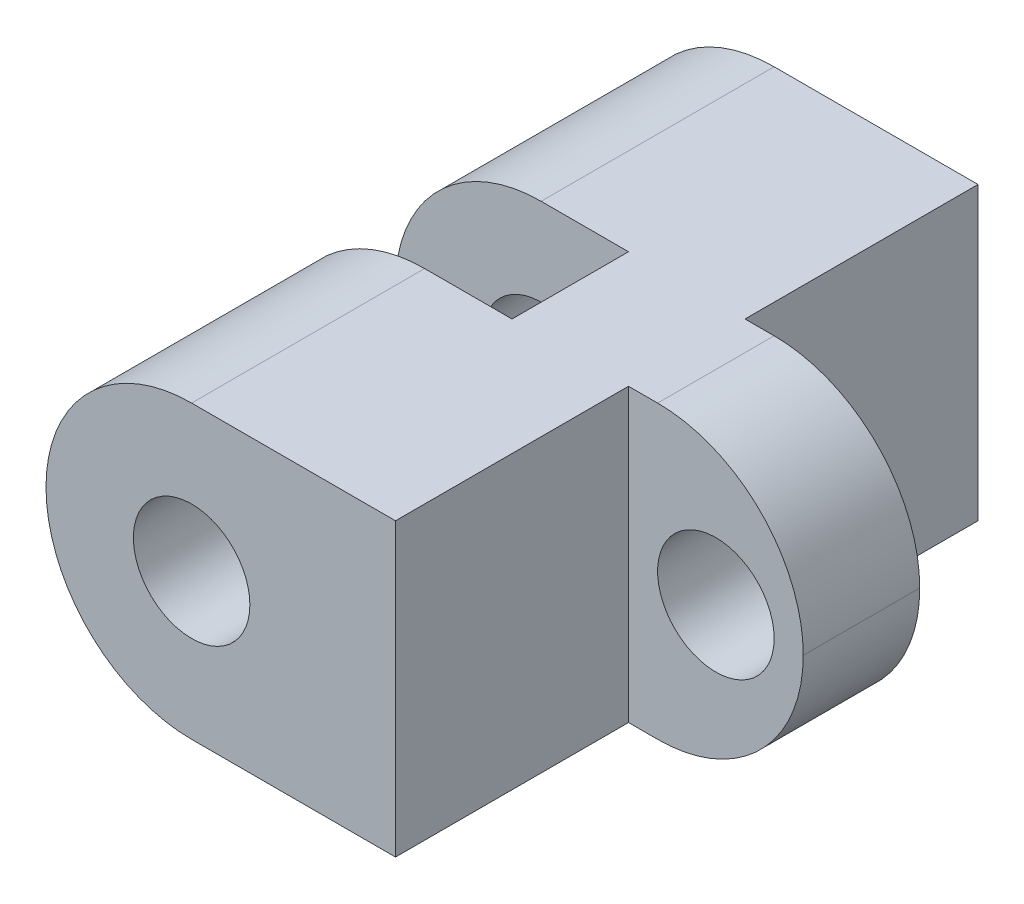
ISO-10303-21;
HEADER;
FILE_DESCRIPTION(('STEP AP214'),'2;1');
FILE_NAME('part.step','',(''),(''),'','','');
FILE_SCHEMA(('AUTOMOTIVE_DESIGN { 1 0 10303 214 1 1 1 1 }'));
ENDSEC;
DATA;
#1=APPLICATION_CONTEXT('core data for automotive mechanical design processes');
#2=APPLICATION_PROTOCOL_DEFINITION('international standard','automotive_design',2000,#1);
#3=PRODUCT_CONTEXT('',#1,'mechanical');
#4=PRODUCT('Part','Part','',(#3));
#5=PRODUCT_RELATED_PRODUCT_CATEGORY('part','',(#4));
#6=PRODUCT_DEFINITION_FORMATION('','',#4);
#7=PRODUCT_DEFINITION_CONTEXT('part definition',#1,'design');
#8=PRODUCT_DEFINITION('design','',#6,#7);
#9=PRODUCT_DEFINITION_SHAPE('','',#8);
#10=(LENGTH_UNIT() NAMED_UNIT(*) SI_UNIT(.MILLI.,.METRE.));
#11=(NAMED_UNIT(*) PLANE_ANGLE_UNIT() SI_UNIT($,.RADIAN.));
#12=(NAMED_UNIT(*) SI_UNIT($,.STERADIAN.) SOLID_ANGLE_UNIT());
#13=UNCERTAINTY_MEASURE_WITH_UNIT(LENGTH_MEASURE(1.E-05),#10,'distance_accuracy_value','');
#14=(GEOMETRIC_REPRESENTATION_CONTEXT(3) GLOBAL_UNCERTAINTY_ASSIGNED_CONTEXT((#13)) GLOBAL_UNIT_ASSIGNED_CONTEXT((#10,
#11,#12)) REPRESENTATION_CONTEXT('',''));
#15=CARTESIAN_POINT('',(0.,0.,0.));
#16=DIRECTION('',(0.,0.,1.));
#17=DIRECTION('',(1.,0.,0.));
#18=AXIS2_PLACEMENT_3D('',#15,#16,#17);
#19=CARTESIAN_POINT('',(-45.,25.,100.));
#20=DIRECTION('',(0.,-1.,0.));
#21=DIRECTION('',(0.,0.,-1.));
#22=AXIS2_PLACEMENT_3D('',#19,#20,#21);
#23=PLANE('',#22);
#24=DIRECTION('',(1.,0.,0.));
#25=VECTOR('',#24,1.);
#26=CARTESIAN_POINT('',(-45.,25.,40.));
#27=LINE('',#26,#25);
#28=CARTESIAN_POINT('',(-20.,25.,40.));
#29=VERTEX_POINT('',#28);
#30=CARTESIAN_POINT('',(-5.,25.,40.));
#31=VERTEX_POINT('',#30);
#32=EDGE_CURVE('E172',#29,#31,#27,.T.);
#33=ORIENTED_EDGE('',*,*,#32,.T.);
#34=DIRECTION('',(0.,0.,1.));
#35=VECTOR('',#34,1.);
#36=CARTESIAN_POINT('',(-5.,25.,40.));
#37=LINE('',#36,#35);
#38=CARTESIAN_POINT('',(-5.,25.,60.));
#39=VERTEX_POINT('',#38);
#40=EDGE_CURVE('E176',#31,#39,#37,.T.);
#41=ORIENTED_EDGE('',*,*,#40,.T.);
#42=DIRECTION('',(1.,0.,0.));
#43=VECTOR('',#42,1.);
#44=CARTESIAN_POINT('',(-45.,25.,60.));
#45=LINE('',#44,#43);
#46=CARTESIAN_POINT('',(-20.,25.,60.));
#47=VERTEX_POINT('',#46);
#48=EDGE_CURVE('E163',#47,#39,#45,.T.);
#49=ORIENTED_EDGE('',*,*,#48,.F.);
#50=DIRECTION('',(0.,0.,-1.));
#51=VECTOR('',#50,1.);
#52=CARTESIAN_POINT('',(-20.,25.,100.));
#53=LINE('',#52,#51);
#54=CARTESIAN_POINT('',(-20.,25.,100.));
#55=VERTEX_POINT('',#54);
#56=EDGE_CURVE('E299',#47,#55,#53,.F.);
#57=ORIENTED_EDGE('',*,*,#56,.T.);
#58=DIRECTION('',(-1.,0.,0.));
#59=VECTOR('',#58,1.);
#60=CARTESIAN_POINT('',(-45.,25.,100.));
#61=LINE('',#60,#59);
#62=CARTESIAN_POINT('',(15.,25.,100.));
#63=VERTEX_POINT('',#62);
#64=EDGE_CURVE('E262',#63,#55,#61,.T.);
#65=ORIENTED_EDGE('',*,*,#64,.F.);
#66=DIRECTION('',(0.,0.,1.));
#67=VECTOR('',#66,1.);
#68=CARTESIAN_POINT('',(15.,25.,100.));
#69=LINE('',#68,#67);
#70=CARTESIAN_POINT('',(15.,25.,60.));
#71=VERTEX_POINT('',#70);
#72=EDGE_CURVE('E248',#71,#63,#69,.T.);
#73=ORIENTED_EDGE('',*,*,#72,.F.);
#74=DIRECTION('',(-1.,0.,0.));
#75=VECTOR('',#74,1.);
#76=CARTESIAN_POINT('',(45.,25.,60.));
#77=LINE('',#76,#75);
#78=CARTESIAN_POINT('',(20.,25.,60.));
#79=VERTEX_POINT('',#78);
#80=EDGE_CURVE('E245',#79,#71,#77,.T.);
#81=ORIENTED_EDGE('',*,*,#80,.F.);
#82=DIRECTION('',(0.,0.,-1.));
#83=VECTOR('',#82,1.);
#84=CARTESIAN_POINT('',(20.,25.,100.));
#85=LINE('',#84,#83);
#86=CARTESIAN_POINT('',(20.,25.,40.));
#87=VERTEX_POINT('',#86);
#88=EDGE_CURVE('E304',#79,#87,#85,.T.);
#89=ORIENTED_EDGE('',*,*,#88,.T.);
#90=DIRECTION('',(1.,0.,0.));
#91=VECTOR('',#90,1.);
#92=CARTESIAN_POINT('',(45.,25.,40.));
#93=LINE('',#92,#91);
#94=CARTESIAN_POINT('',(15.,25.,40.));
#95=VERTEX_POINT('',#94);
#96=EDGE_CURVE('E227',#95,#87,#93,.T.);
#97=ORIENTED_EDGE('',*,*,#96,.F.);
#98=DIRECTION('',(0.,0.,1.));
#99=VECTOR('',#98,1.);
#100=CARTESIAN_POINT('',(15.,25.,0.));
#101=LINE('',#100,#99);
#102=CARTESIAN_POINT('',(15.,25.,0.));
#103=VERTEX_POINT('',#102);
#104=EDGE_CURVE('E224',#103,#95,#101,.T.);
#105=ORIENTED_EDGE('',*,*,#104,.F.);
#106=DIRECTION('',(-1.,0.,0.));
#107=VECTOR('',#106,1.);
#108=CARTESIAN_POINT('',(-45.,25.,0.));
#109=LINE('',#108,#107);
#110=CARTESIAN_POINT('',(-20.,25.,0.));
#111=VERTEX_POINT('',#110);
#112=EDGE_CURVE('E272',#103,#111,#109,.T.);
#113=ORIENTED_EDGE('',*,*,#112,.T.);
#114=EDGE_CURVE('E300',#111,#29,#53,.F.);
#115=ORIENTED_EDGE('',*,*,#114,.T.);
#116=EDGE_LOOP('',(#33,#41,#49,#57,#65,#73,#81,#89,#97,#105,#113,#115));
#117=FACE_BOUND('',#116,.T.);
#118=ADVANCED_FACE('F38',(#117),#23,.F.);
#119=CARTESIAN_POINT('',(-45.,-25.,100.));
#120=DIRECTION('',(0.,1.,0.));
#121=DIRECTION('',(0.,0.,1.));
#122=AXIS2_PLACEMENT_3D('',#119,#120,#121);
#123=PLANE('',#122);
#124=DIRECTION('',(1.,0.,0.));
#125=VECTOR('',#124,1.);
#126=CARTESIAN_POINT('',(-45.,-25.,40.));
#127=LINE('',#126,#125);
#128=CARTESIAN_POINT('',(-20.,-25.,40.));
#129=VERTEX_POINT('',#128);
#130=CARTESIAN_POINT('',(-5.,-25.,40.));
#131=VERTEX_POINT('',#130);
#132=EDGE_CURVE('E158',#129,#131,#127,.T.);
#133=ORIENTED_EDGE('',*,*,#132,.F.);
#134=DIRECTION('',(0.,0.,-1.));
#135=VECTOR('',#134,1.);
#136=CARTESIAN_POINT('',(-20.,-25.,100.));
#137=LINE('',#136,#135);
#138=CARTESIAN_POINT('',(-20.,-25.,0.));
#139=VERTEX_POINT('',#138);
#140=EDGE_CURVE('E286',#129,#139,#137,.T.);
#141=ORIENTED_EDGE('',*,*,#140,.T.);
#142=DIRECTION('',(1.,0.,0.));
#143=VECTOR('',#142,1.);
#144=CARTESIAN_POINT('',(-45.,-25.,0.));
#145=LINE('',#144,#143);
#146=CARTESIAN_POINT('',(15.,-25.,0.));
#147=VERTEX_POINT('',#146);
#148=EDGE_CURVE('E267',#139,#147,#145,.T.);
#149=ORIENTED_EDGE('',*,*,#148,.T.);
#150=DIRECTION('',(0.,0.,1.));
#151=VECTOR('',#150,1.);
#152=CARTESIAN_POINT('',(15.,-25.,0.));
#153=LINE('',#152,#151);
#154=CARTESIAN_POINT('',(15.,-25.,40.));
#155=VERTEX_POINT('',#154);
#156=EDGE_CURVE('E215',#147,#155,#153,.T.);
#157=ORIENTED_EDGE('',*,*,#156,.T.);
#158=DIRECTION('',(1.,0.,0.));
#159=VECTOR('',#158,1.);
#160=CARTESIAN_POINT('',(45.,-25.,40.));
#161=LINE('',#160,#159);
#162=CARTESIAN_POINT('',(20.,-25.,40.));
#163=VERTEX_POINT('',#162);
#164=EDGE_CURVE('E219',#155,#163,#161,.T.);
#165=ORIENTED_EDGE('',*,*,#164,.T.);
#166=DIRECTION('',(0.,0.,-1.));
#167=VECTOR('',#166,1.);
#168=CARTESIAN_POINT('',(20.,-25.,100.));
#169=LINE('',#168,#167);
#170=CARTESIAN_POINT('',(20.,-25.,60.));
#171=VERTEX_POINT('',#170);
#172=EDGE_CURVE('E289',#163,#171,#169,.F.);
#173=ORIENTED_EDGE('',*,*,#172,.T.);
#174=DIRECTION('',(-1.,0.,0.));
#175=VECTOR('',#174,1.);
#176=CARTESIAN_POINT('',(45.,-25.,60.));
#177=LINE('',#176,#175);
#178=CARTESIAN_POINT('',(15.,-25.,60.));
#179=VERTEX_POINT('',#178);
#180=EDGE_CURVE('E211',#171,#179,#177,.T.);
#181=ORIENTED_EDGE('',*,*,#180,.T.);
#182=DIRECTION('',(0.,0.,1.));
#183=VECTOR('',#182,1.);
#184=CARTESIAN_POINT('',(15.,-25.,100.));
#185=LINE('',#184,#183);
#186=CARTESIAN_POINT('',(15.,-25.,100.));
#187=VERTEX_POINT('',#186);
#188=EDGE_CURVE('E241',#179,#187,#185,.T.);
#189=ORIENTED_EDGE('',*,*,#188,.T.);
#190=DIRECTION('',(1.,0.,0.));
#191=VECTOR('',#190,1.);
#192=CARTESIAN_POINT('',(-45.,-25.,100.));
#193=LINE('',#192,#191);
#194=CARTESIAN_POINT('',(-20.,-25.,100.));
#195=VERTEX_POINT('',#194);
#196=EDGE_CURVE('E266',#195,#187,#193,.T.);
#197=ORIENTED_EDGE('',*,*,#196,.F.);
#198=CARTESIAN_POINT('',(-20.,-25.,60.));
#199=VERTEX_POINT('',#198);
#200=EDGE_CURVE('E170',#195,#199,#137,.T.);
#201=ORIENTED_EDGE('',*,*,#200,.T.);
#202=DIRECTION('',(1.,0.,0.));
#203=VECTOR('',#202,1.);
#204=CARTESIAN_POINT('',(-45.,-25.,60.));
#205=LINE('',#204,#203);
#206=CARTESIAN_POINT('',(-5.,-25.,60.));
#207=VERTEX_POINT('',#206);
#208=EDGE_CURVE('E56',#199,#207,#205,.T.);
#209=ORIENTED_EDGE('',*,*,#208,.T.);
#210=DIRECTION('',(0.,0.,1.));
#211=VECTOR('',#210,1.);
#212=CARTESIAN_POINT('',(-5.,-25.,40.));
#213=LINE('',#212,#211);
#214=EDGE_CURVE('E149',#131,#207,#213,.T.);
#215=ORIENTED_EDGE('',*,*,#214,.F.);
#216=EDGE_LOOP('',(#133,#141,#149,#157,#165,#173,#181,#189,#197,#201,#209,#215));
#217=FACE_BOUND('',#216,.T.);
#218=ADVANCED_FACE('F167',(#217),#123,.F.);
#219=CARTESIAN_POINT('',(-20.,0.,100.));
#220=DIRECTION('',(0.,0.,-1.));
#221=DIRECTION('',(-1.,0.,0.));
#222=AXIS2_PLACEMENT_3D('',#219,#220,#221);
#223=CYLINDRICAL_SURFACE('',#222,25.);
#224=DIRECTION('',(0.,0.,-1.));
#225=VECTOR('',#224,1.);
#226=CARTESIAN_POINT('',(-45.,0.,100.));
#227=LINE('',#226,#225);
#228=CARTESIAN_POINT('',(-45.,0.,40.));
#229=VERTEX_POINT('',#228);
#230=CARTESIAN_POINT('',(-45.,0.,0.));
#231=VERTEX_POINT('',#230);
#232=EDGE_CURVE('E261',#229,#231,#227,.T.);
#233=ORIENTED_EDGE('',*,*,#232,.F.);
#234=CARTESIAN_POINT('',(-20.,0.,40.));
#235=DIRECTION('',(0.,0.,1.));
#236=DIRECTION('',(1.,0.,0.));
#237=AXIS2_PLACEMENT_3D('',#234,#235,#236);
#238=CIRCLE('',#237,25.);
#239=EDGE_CURVE('E202',#229,#29,#238,.F.);
#240=ORIENTED_EDGE('',*,*,#239,.T.);
#241=ORIENTED_EDGE('',*,*,#114,.F.);
#242=CARTESIAN_POINT('',(-20.,0.,0.));
#243=DIRECTION('',(0.,0.,-1.));
#244=DIRECTION('',(-1.,0.,0.));
#245=AXIS2_PLACEMENT_3D('',#242,#243,#244);
#246=CIRCLE('',#245,25.);
#247=EDGE_CURVE('E271',#231,#111,#246,.T.);
#248=ORIENTED_EDGE('',*,*,#247,.F.);
#249=EDGE_LOOP('',(#233,#240,#241,#248));
#250=FACE_BOUND('',#249,.T.);
#251=ADVANCED_FACE('F341',(#250),#223,.T.);
#252=CARTESIAN_POINT('',(-20.,0.,100.));
#253=DIRECTION('',(0.,0.,-1.));
#254=DIRECTION('',(-1.,0.,0.));
#255=AXIS2_PLACEMENT_3D('',#252,#253,#254);
#256=CYLINDRICAL_SURFACE('',#255,25.);
#257=ORIENTED_EDGE('',*,*,#140,.F.);
#258=CARTESIAN_POINT('',(-20.,0.,40.));
#259=DIRECTION('',(0.,0.,1.));
#260=DIRECTION('',(1.,0.,0.));
#261=AXIS2_PLACEMENT_3D('',#258,#259,#260);
#262=CIRCLE('',#261,25.);
#263=EDGE_CURVE('E198',#129,#229,#262,.F.);
#264=ORIENTED_EDGE('',*,*,#263,.T.);
#265=ORIENTED_EDGE('',*,*,#232,.T.);
#266=CARTESIAN_POINT('',(-20.,0.,0.));
#267=DIRECTION('',(0.,0.,-1.));
#268=DIRECTION('',(-1.,0.,0.));
#269=AXIS2_PLACEMENT_3D('',#266,#267,#268);
#270=CIRCLE('',#269,25.);
#271=EDGE_CURVE('E282',#139,#231,#270,.T.);
#272=ORIENTED_EDGE('',*,*,#271,.F.);
#273=EDGE_LOOP('',(#257,#264,#265,#272));
#274=FACE_BOUND('',#273,.T.);
#275=ADVANCED_FACE('F357',(#274),#256,.T.);
#276=CARTESIAN_POINT('',(-20.,0.,0.));
#277=DIRECTION('',(0.,0.,1.));
#278=DIRECTION('',(1.,0.,0.));
#279=AXIS2_PLACEMENT_3D('',#276,#277,#278);
#280=CYLINDRICAL_SURFACE('',#279,10.);
#281=CARTESIAN_POINT('',(-20.,0.,0.));
#282=DIRECTION('',(0.,0.,1.));
#283=DIRECTION('',(1.,0.,0.));
#284=AXIS2_PLACEMENT_3D('',#281,#282,#283);
#285=CIRCLE('',#284,10.);
#286=CARTESIAN_POINT('',(-10.,0.,0.));
#287=VERTEX_POINT('',#286);
#288=EDGE_CURVE('E207',#287,#287,#285,.T.);
#289=ORIENTED_EDGE('',*,*,#288,.F.);
#290=EDGE_LOOP('',(#289));
#291=FACE_BOUND('',#290,.T.);
#292=CARTESIAN_POINT('',(-20.,0.,40.));
#293=DIRECTION('',(0.,0.,1.));
#294=DIRECTION('',(1.,0.,0.));
#295=AXIS2_PLACEMENT_3D('',#292,#293,#294);
#296=CIRCLE('',#295,10.);
#297=CARTESIAN_POINT('',(-10.,0.,40.));
#298=VERTEX_POINT('',#297);
#299=EDGE_CURVE('E42',#298,#298,#296,.F.);
#300=ORIENTED_EDGE('',*,*,#299,.F.);
#301=EDGE_LOOP('',(#300));
#302=FACE_BOUND('',#301,.T.);
#303=ADVANCED_FACE('F368',(#291,#302),#280,.F.);
#304=CARTESIAN_POINT('',(0.,0.,100.));
#305=DIRECTION('',(0.,0.,-1.));
#306=DIRECTION('',(-1.,0.,0.));
#307=AXIS2_PLACEMENT_3D('',#304,#305,#306);
#308=PLANE('',#307);
#309=CARTESIAN_POINT('',(-20.,0.,100.));
#310=DIRECTION('',(0.,0.,1.));
#311=DIRECTION('',(1.,0.,0.));
#312=AXIS2_PLACEMENT_3D('',#309,#310,#311);
#313=CIRCLE('',#312,10.);
#314=CARTESIAN_POINT('',(-10.,0.,100.));
#315=VERTEX_POINT('',#314);
#316=EDGE_CURVE('E206',#315,#315,#313,.T.);
#317=ORIENTED_EDGE('',*,*,#316,.F.);
#318=EDGE_LOOP('',(#317));
#319=FACE_BOUND('',#318,.T.);
#320=DIRECTION('',(0.,-1.,0.));
#321=VECTOR('',#320,1.);
#322=CARTESIAN_POINT('',(15.,25.,100.));
#323=LINE('',#322,#321);
#324=EDGE_CURVE('E251',#63,#187,#323,.T.);
#325=ORIENTED_EDGE('',*,*,#324,.F.);
#326=ORIENTED_EDGE('',*,*,#64,.T.);
#327=CARTESIAN_POINT('',(-20.,0.,100.));
#328=DIRECTION('',(0.,0.,-1.));
#329=DIRECTION('',(-1.,0.,0.));
#330=AXIS2_PLACEMENT_3D('',#327,#328,#329);
#331=CIRCLE('',#330,25.);
#332=CARTESIAN_POINT('',(-45.,0.,100.));
#333=VERTEX_POINT('',#332);
#334=EDGE_CURVE('E293',#55,#333,#331,.F.);
#335=ORIENTED_EDGE('',*,*,#334,.T.);
#336=CARTESIAN_POINT('',(-20.,0.,100.));
#337=DIRECTION('',(0.,0.,-1.));
#338=DIRECTION('',(-1.,0.,0.));
#339=AXIS2_PLACEMENT_3D('',#336,#337,#338);
#340=CIRCLE('',#339,25.);
#341=EDGE_CURVE('E296',#333,#195,#340,.F.);
#342=ORIENTED_EDGE('',*,*,#341,.T.);
#343=ORIENTED_EDGE('',*,*,#196,.T.);
#344=EDGE_LOOP('',(#325,#326,#335,#342,#343));
#345=FACE_BOUND('',#344,.T.);
#346=ADVANCED_FACE('F374',(#319,#345),#308,.F.);
#347=CARTESIAN_POINT('',(0.,0.,0.));
#348=DIRECTION('',(0.,0.,-1.));
#349=DIRECTION('',(-1.,0.,0.));
#350=AXIS2_PLACEMENT_3D('',#347,#348,#349);
#351=PLANE('',#350);
#352=ORIENTED_EDGE('',*,*,#288,.T.);
#353=EDGE_LOOP('',(#352));
#354=FACE_BOUND('',#353,.T.);
#355=ORIENTED_EDGE('',*,*,#112,.F.);
#356=DIRECTION('',(0.,-1.,0.));
#357=VECTOR('',#356,1.);
#358=CARTESIAN_POINT('',(15.,25.,0.));
#359=LINE('',#358,#357);
#360=EDGE_CURVE('E233',#103,#147,#359,.T.);
#361=ORIENTED_EDGE('',*,*,#360,.T.);
#362=ORIENTED_EDGE('',*,*,#148,.F.);
#363=ORIENTED_EDGE('',*,*,#271,.T.);
#364=ORIENTED_EDGE('',*,*,#247,.T.);
#365=EDGE_LOOP('',(#355,#361,#362,#363,#364));
#366=FACE_BOUND('',#365,.T.);
#367=ADVANCED_FACE('F351',(#354,#366),#351,.T.);
#368=CARTESIAN_POINT('',(20.,0.,100.));
#369=DIRECTION('',(0.,0.,-1.));
#370=DIRECTION('',(-1.,0.,0.));
#371=AXIS2_PLACEMENT_3D('',#368,#369,#370);
#372=CYLINDRICAL_SURFACE('',#371,25.);
#373=DIRECTION('',(0.,0.,-1.));
#374=VECTOR('',#373,1.);
#375=CARTESIAN_POINT('',(45.,0.,100.));
#376=LINE('',#375,#374);
#377=CARTESIAN_POINT('',(45.,0.,40.));
#378=VERTEX_POINT('',#377);
#379=CARTESIAN_POINT('',(45.,0.,60.));
#380=VERTEX_POINT('',#379);
#381=EDGE_CURVE('E275',#378,#380,#376,.F.);
#382=ORIENTED_EDGE('',*,*,#381,.F.);
#383=CARTESIAN_POINT('',(20.,0.,40.));
#384=DIRECTION('',(0.,0.,-1.));
#385=DIRECTION('',(-1.,0.,0.));
#386=AXIS2_PLACEMENT_3D('',#383,#384,#385);
#387=CIRCLE('',#386,25.);
#388=EDGE_CURVE('E64',#378,#87,#387,.F.);
#389=ORIENTED_EDGE('',*,*,#388,.T.);
#390=ORIENTED_EDGE('',*,*,#88,.F.);
#391=CARTESIAN_POINT('',(20.,0.,60.));
#392=DIRECTION('',(0.,0.,1.));
#393=DIRECTION('',(1.,0.,0.));
#394=AXIS2_PLACEMENT_3D('',#391,#392,#393);
#395=CIRCLE('',#394,25.);
#396=EDGE_CURVE('E237',#79,#380,#395,.F.);
#397=ORIENTED_EDGE('',*,*,#396,.T.);
#398=EDGE_LOOP('',(#382,#389,#390,#397));
#399=FACE_BOUND('',#398,.T.);
#400=ADVANCED_FACE('F348',(#399),#372,.T.);
#401=CARTESIAN_POINT('',(20.,0.,100.));
#402=DIRECTION('',(0.,0.,-1.));
#403=DIRECTION('',(-1.,0.,0.));
#404=AXIS2_PLACEMENT_3D('',#401,#402,#403);
#405=CYLINDRICAL_SURFACE('',#404,25.);
#406=ORIENTED_EDGE('',*,*,#172,.F.);
#407=CARTESIAN_POINT('',(20.,0.,40.));
#408=DIRECTION('',(0.,0.,-1.));
#409=DIRECTION('',(-1.,0.,0.));
#410=AXIS2_PLACEMENT_3D('',#407,#408,#409);
#411=CIRCLE('',#410,25.);
#412=EDGE_CURVE('E11',#163,#378,#411,.F.);
#413=ORIENTED_EDGE('',*,*,#412,.T.);
#414=ORIENTED_EDGE('',*,*,#381,.T.);
#415=CARTESIAN_POINT('',(20.,0.,60.));
#416=DIRECTION('',(0.,0.,1.));
#417=DIRECTION('',(1.,0.,0.));
#418=AXIS2_PLACEMENT_3D('',#415,#416,#417);
#419=CIRCLE('',#418,25.);
#420=EDGE_CURVE('E48',#380,#171,#419,.F.);
#421=ORIENTED_EDGE('',*,*,#420,.T.);
#422=EDGE_LOOP('',(#406,#413,#414,#421));
#423=FACE_BOUND('',#422,.T.);
#424=ADVANCED_FACE('F345',(#423),#405,.T.);
#425=CARTESIAN_POINT('',(-20.,0.,60.));
#426=DIRECTION('',(0.,0.,1.));
#427=DIRECTION('',(1.,0.,0.));
#428=AXIS2_PLACEMENT_3D('',#425,#426,#427);
#429=CIRCLE('',#428,25.);
#430=CARTESIAN_POINT('',(-45.,0.,60.));
#431=VERTEX_POINT('',#430);
#432=EDGE_CURVE('E195',#431,#47,#429,.F.);
#433=ORIENTED_EDGE('',*,*,#432,.F.);
#434=EDGE_CURVE('E311',#333,#431,#227,.T.);
#435=ORIENTED_EDGE('',*,*,#434,.F.);
#436=ORIENTED_EDGE('',*,*,#334,.F.);
#437=ORIENTED_EDGE('',*,*,#56,.F.);
#438=EDGE_LOOP('',(#433,#435,#436,#437));
#439=FACE_BOUND('',#438,.T.);
#440=ADVANCED_FACE('F40',(#439),#223,.T.);
#441=CARTESIAN_POINT('',(-20.,0.,60.));
#442=DIRECTION('',(0.,0.,1.));
#443=DIRECTION('',(1.,0.,0.));
#444=AXIS2_PLACEMENT_3D('',#441,#442,#443);
#445=CIRCLE('',#444,25.);
#446=EDGE_CURVE('E192',#199,#431,#445,.F.);
#447=ORIENTED_EDGE('',*,*,#446,.F.);
#448=ORIENTED_EDGE('',*,*,#200,.F.);
#449=ORIENTED_EDGE('',*,*,#341,.F.);
#450=ORIENTED_EDGE('',*,*,#434,.T.);
#451=EDGE_LOOP('',(#447,#448,#449,#450));
#452=FACE_BOUND('',#451,.T.);
#453=ADVANCED_FACE('F353',(#452),#256,.T.);
#454=CARTESIAN_POINT('',(45.,25.,60.));
#455=DIRECTION('',(0.,0.,1.));
#456=DIRECTION('',(1.,0.,0.));
#457=AXIS2_PLACEMENT_3D('',#454,#455,#456);
#458=PLANE('',#457);
#459=CARTESIAN_POINT('',(30.,0.,60.));
#460=DIRECTION('',(0.,0.,1.));
#461=DIRECTION('',(1.,0.,0.));
#462=AXIS2_PLACEMENT_3D('',#459,#460,#461);
#463=CIRCLE('',#462,10.);
#464=CARTESIAN_POINT('',(40.,0.,60.));
#465=VERTEX_POINT('',#464);
#466=EDGE_CURVE('E179',#465,#465,#463,.T.);
#467=ORIENTED_EDGE('',*,*,#466,.F.);
#468=EDGE_LOOP('',(#467));
#469=FACE_BOUND('',#468,.T.);
#470=ORIENTED_EDGE('',*,*,#80,.T.);
#471=DIRECTION('',(0.,-1.,0.));
#472=VECTOR('',#471,1.);
#473=CARTESIAN_POINT('',(15.,25.,60.));
#474=LINE('',#473,#472);
#475=EDGE_CURVE('E220',#71,#179,#474,.T.);
#476=ORIENTED_EDGE('',*,*,#475,.T.);
#477=ORIENTED_EDGE('',*,*,#180,.F.);
#478=ORIENTED_EDGE('',*,*,#420,.F.);
#479=ORIENTED_EDGE('',*,*,#396,.F.);
#480=EDGE_LOOP('',(#470,#476,#477,#478,#479));
#481=FACE_BOUND('',#480,.T.);
#482=ADVANCED_FACE('F355',(#469,#481),#458,.T.);
#483=CARTESIAN_POINT('',(15.,25.,100.));
#484=DIRECTION('',(1.,0.,0.));
#485=DIRECTION('',(0.,0.,-1.));
#486=AXIS2_PLACEMENT_3D('',#483,#484,#485);
#487=PLANE('',#486);
#488=ORIENTED_EDGE('',*,*,#475,.F.);
#489=ORIENTED_EDGE('',*,*,#72,.T.);
#490=ORIENTED_EDGE('',*,*,#324,.T.);
#491=ORIENTED_EDGE('',*,*,#188,.F.);
#492=EDGE_LOOP('',(#488,#489,#490,#491));
#493=FACE_BOUND('',#492,.T.);
#494=ADVANCED_FACE('F363',(#493),#487,.T.);
#495=CARTESIAN_POINT('',(15.,25.,0.));
#496=DIRECTION('',(1.,0.,0.));
#497=DIRECTION('',(0.,0.,-1.));
#498=AXIS2_PLACEMENT_3D('',#495,#496,#497);
#499=PLANE('',#498);
#500=ORIENTED_EDGE('',*,*,#360,.F.);
#501=ORIENTED_EDGE('',*,*,#104,.T.);
#502=DIRECTION('',(0.,-1.,0.));
#503=VECTOR('',#502,1.);
#504=CARTESIAN_POINT('',(15.,25.,40.));
#505=LINE('',#504,#503);
#506=EDGE_CURVE('E230',#95,#155,#505,.T.);
#507=ORIENTED_EDGE('',*,*,#506,.T.);
#508=ORIENTED_EDGE('',*,*,#156,.F.);
#509=EDGE_LOOP('',(#500,#501,#507,#508));
#510=FACE_BOUND('',#509,.T.);
#511=ADVANCED_FACE('F397',(#510),#499,.T.);
#512=CARTESIAN_POINT('',(45.,25.,40.));
#513=DIRECTION('',(0.,0.,-1.));
#514=DIRECTION('',(-1.,0.,0.));
#515=AXIS2_PLACEMENT_3D('',#512,#513,#514);
#516=PLANE('',#515);
#517=CARTESIAN_POINT('',(30.,0.,40.0000000000001));
#518=DIRECTION('',(0.,0.,1.));
#519=DIRECTION('',(1.,0.,0.));
#520=AXIS2_PLACEMENT_3D('',#517,#518,#519);
#521=CIRCLE('',#520,10.);
#522=CARTESIAN_POINT('',(40.,0.,40.0000000000001));
#523=VERTEX_POINT('',#522);
#524=EDGE_CURVE('E186',#523,#523,#521,.T.);
#525=ORIENTED_EDGE('',*,*,#524,.T.);
#526=EDGE_LOOP('',(#525));
#527=FACE_BOUND('',#526,.T.);
#528=ORIENTED_EDGE('',*,*,#412,.F.);
#529=ORIENTED_EDGE('',*,*,#164,.F.);
#530=ORIENTED_EDGE('',*,*,#506,.F.);
#531=ORIENTED_EDGE('',*,*,#96,.T.);
#532=ORIENTED_EDGE('',*,*,#388,.F.);
#533=EDGE_LOOP('',(#528,#529,#530,#531,#532));
#534=FACE_BOUND('',#533,.T.);
#535=ADVANCED_FACE('F399',(#527,#534),#516,.T.);
#536=CARTESIAN_POINT('',(-20.,0.,60.));
#537=DIRECTION('',(0.,0.,1.));
#538=DIRECTION('',(1.,0.,0.));
#539=AXIS2_PLACEMENT_3D('',#536,#537,#538);
#540=CIRCLE('',#539,10.);
#541=CARTESIAN_POINT('',(-10.,0.,60.));
#542=VERTEX_POINT('',#541);
#543=EDGE_CURVE('E190',#542,#542,#540,.F.);
#544=ORIENTED_EDGE('',*,*,#543,.T.);
#545=EDGE_LOOP('',(#544));
#546=FACE_BOUND('',#545,.T.);
#547=ORIENTED_EDGE('',*,*,#316,.T.);
#548=EDGE_LOOP('',(#547));
#549=FACE_BOUND('',#548,.T.);
#550=ADVANCED_FACE('F321',(#546,#549),#280,.F.);
#551=CARTESIAN_POINT('',(-45.,-25.,40.));
#552=DIRECTION('',(0.,0.,1.));
#553=DIRECTION('',(1.,0.,0.));
#554=AXIS2_PLACEMENT_3D('',#551,#552,#553);
#555=PLANE('',#554);
#556=ORIENTED_EDGE('',*,*,#263,.F.);
#557=ORIENTED_EDGE('',*,*,#132,.T.);
#558=DIRECTION('',(0.,1.,0.));
#559=VECTOR('',#558,1.);
#560=CARTESIAN_POINT('',(-5.,-25.,40.));
#561=LINE('',#560,#559);
#562=EDGE_CURVE('E154',#131,#31,#561,.T.);
#563=ORIENTED_EDGE('',*,*,#562,.T.);
#564=ORIENTED_EDGE('',*,*,#32,.F.);
#565=ORIENTED_EDGE('',*,*,#239,.F.);
#566=EDGE_LOOP('',(#556,#557,#563,#564,#565));
#567=FACE_BOUND('',#566,.T.);
#568=ORIENTED_EDGE('',*,*,#299,.T.);
#569=EDGE_LOOP('',(#568));
#570=FACE_BOUND('',#569,.T.);
#571=ADVANCED_FACE('F324',(#567,#570),#555,.T.);
#572=CARTESIAN_POINT('',(-45.,-25.,60.));
#573=DIRECTION('',(0.,0.,1.));
#574=DIRECTION('',(1.,0.,0.));
#575=AXIS2_PLACEMENT_3D('',#572,#573,#574);
#576=PLANE('',#575);
#577=ORIENTED_EDGE('',*,*,#432,.T.);
#578=ORIENTED_EDGE('',*,*,#48,.T.);
#579=DIRECTION('',(0.,1.,0.));
#580=VECTOR('',#579,1.);
#581=CARTESIAN_POINT('',(-5.,-25.,60.));
#582=LINE('',#581,#580);
#583=EDGE_CURVE('E152',#207,#39,#582,.T.);
#584=ORIENTED_EDGE('',*,*,#583,.F.);
#585=ORIENTED_EDGE('',*,*,#208,.F.);
#586=ORIENTED_EDGE('',*,*,#446,.T.);
#587=EDGE_LOOP('',(#577,#578,#584,#585,#586));
#588=FACE_BOUND('',#587,.T.);
#589=ORIENTED_EDGE('',*,*,#543,.F.);
#590=EDGE_LOOP('',(#589));
#591=FACE_BOUND('',#590,.T.);
#592=ADVANCED_FACE('F160',(#588,#591),#576,.F.);
#593=CARTESIAN_POINT('',(-5.,-25.,40.));
#594=DIRECTION('',(-1.,0.,0.));
#595=DIRECTION('',(0.,0.,1.));
#596=AXIS2_PLACEMENT_3D('',#593,#594,#595);
#597=PLANE('',#596);
#598=ORIENTED_EDGE('',*,*,#40,.F.);
#599=ORIENTED_EDGE('',*,*,#562,.F.);
#600=ORIENTED_EDGE('',*,*,#214,.T.);
#601=ORIENTED_EDGE('',*,*,#583,.T.);
#602=EDGE_LOOP('',(#598,#599,#600,#601));
#603=FACE_BOUND('',#602,.T.);
#604=ADVANCED_FACE('F151',(#603),#597,.T.);
#605=CARTESIAN_POINT('',(30.,0.,40.0000000000001));
#606=DIRECTION('',(0.,0.,1.));
#607=DIRECTION('',(1.,0.,0.));
#608=AXIS2_PLACEMENT_3D('',#605,#606,#607);
#609=CYLINDRICAL_SURFACE('',#608,10.);
#610=ORIENTED_EDGE('',*,*,#524,.F.);
#611=EDGE_LOOP('',(#610));
#612=FACE_BOUND('',#611,.T.);
#613=ORIENTED_EDGE('',*,*,#466,.T.);
#614=EDGE_LOOP('',(#613));
#615=FACE_BOUND('',#614,.T.);
#616=ADVANCED_FACE('F330',(#612,#615),#609,.F.);
#617=CLOSED_SHELL('',(#118,#218,#251,#275,#303,#346,#367,#400,#424,#440,#453,#482,#494,#511,
#535,#550,#571,#592,#604,#616));
#618=MANIFOLD_SOLID_BREP('B2',#617);
#619=ADVANCED_BREP_SHAPE_REPRESENTATION('',(#18,#618),#14);
#620=SHAPE_DEFINITION_REPRESENTATION(#9,#619);
ENDSEC;
END-ISO-10303-21;
